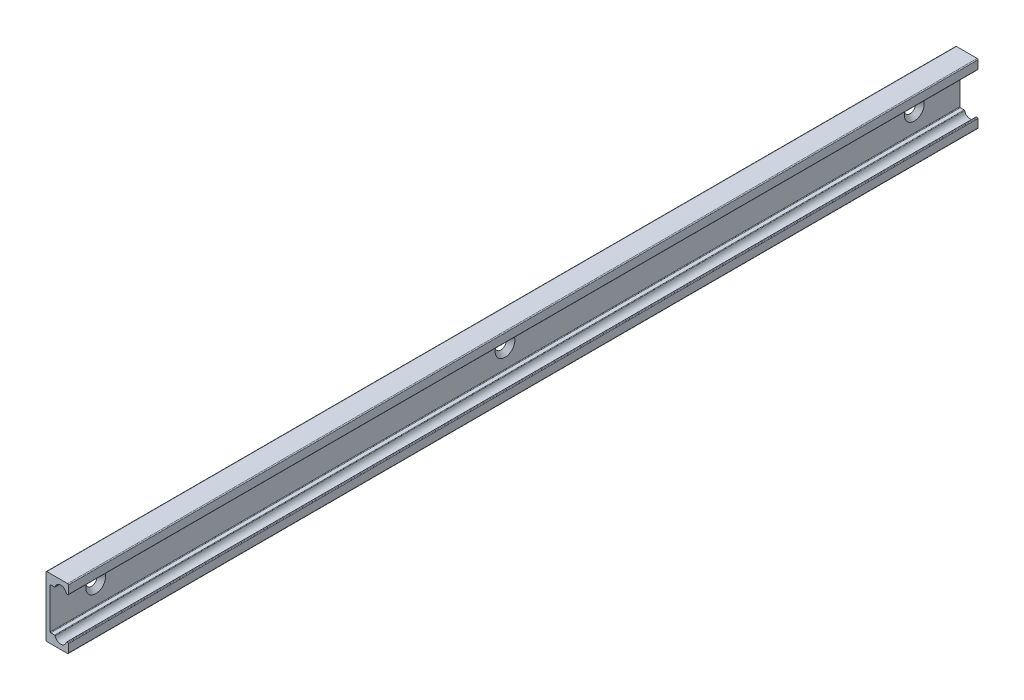
ISO-10303-21;
HEADER;
FILE_DESCRIPTION(('STEP AP214'),'2;1');
FILE_NAME('part.step','',(''),(''),'','','');
FILE_SCHEMA(('AUTOMOTIVE_DESIGN { 1 0 10303 214 1 1 1 1 }'));
ENDSEC;
DATA;
#1=APPLICATION_CONTEXT('core data for automotive mechanical design processes');
#2=APPLICATION_PROTOCOL_DEFINITION('international standard','automotive_design',2000,#1);
#3=PRODUCT_CONTEXT('',#1,'mechanical');
#4=PRODUCT('Part','Part','',(#3));
#5=PRODUCT_RELATED_PRODUCT_CATEGORY('part','',(#4));
#6=PRODUCT_DEFINITION_FORMATION('','',#4);
#7=PRODUCT_DEFINITION_CONTEXT('part definition',#1,'design');
#8=PRODUCT_DEFINITION('design','',#6,#7);
#9=PRODUCT_DEFINITION_SHAPE('','',#8);
#10=(LENGTH_UNIT() NAMED_UNIT(*) SI_UNIT(.MILLI.,.METRE.));
#11=(NAMED_UNIT(*) PLANE_ANGLE_UNIT() SI_UNIT($,.RADIAN.));
#12=(NAMED_UNIT(*) SI_UNIT($,.STERADIAN.) SOLID_ANGLE_UNIT());
#13=UNCERTAINTY_MEASURE_WITH_UNIT(LENGTH_MEASURE(1.E-05),#10,'distance_accuracy_value','');
#14=(GEOMETRIC_REPRESENTATION_CONTEXT(3) GLOBAL_UNCERTAINTY_ASSIGNED_CONTEXT((#13)) GLOBAL_UNIT_ASSIGNED_CONTEXT((#10,
#11,#12)) REPRESENTATION_CONTEXT('',''));
#15=CARTESIAN_POINT('',(0.,0.,0.));
#16=DIRECTION('',(0.,0.,1.));
#17=DIRECTION('',(1.,0.,0.));
#18=AXIS2_PLACEMENT_3D('',#15,#16,#17);
#19=CARTESIAN_POINT('',(-2.2,15.75,500.));
#20=DIRECTION('',(1.,0.,0.));
#21=DIRECTION('',(0.,0.,-1.));
#22=AXIS2_PLACEMENT_3D('',#19,#20,#21);
#23=PLANE('',#22);
#24=CARTESIAN_POINT('',(-2.2,6.05,350.));
#25=DIRECTION('',(1.,0.,0.));
#26=DIRECTION('',(0.,0.,-1.));
#27=AXIS2_PLACEMENT_3D('',#24,#25,#26);
#28=CIRCLE('',#27,1.85);
#29=CARTESIAN_POINT('',(-2.2,6.05,348.15));
#30=VERTEX_POINT('',#29);
#31=EDGE_CURVE('E12',#30,#30,#28,.T.);
#32=ORIENTED_EDGE('',*,*,#31,.T.);
#33=EDGE_LOOP('',(#32));
#34=FACE_BOUND('',#33,.T.);
#35=CARTESIAN_POINT('',(-2.2,6.05,215.));
#36=DIRECTION('',(1.,0.,0.));
#37=DIRECTION('',(0.,0.,-1.));
#38=AXIS2_PLACEMENT_3D('',#35,#36,#37);
#39=CIRCLE('',#38,1.85);
#40=CARTESIAN_POINT('',(-2.2,6.05,213.15));
#41=VERTEX_POINT('',#40);
#42=EDGE_CURVE('E57',#41,#41,#39,.T.);
#43=ORIENTED_EDGE('',*,*,#42,.T.);
#44=EDGE_LOOP('',(#43));
#45=FACE_BOUND('',#44,.T.);
#46=CARTESIAN_POINT('',(-2.2,6.05,485.));
#47=DIRECTION('',(1.,0.,0.));
#48=DIRECTION('',(0.,0.,-1.));
#49=AXIS2_PLACEMENT_3D('',#46,#47,#48);
#50=CIRCLE('',#49,1.85);
#51=CARTESIAN_POINT('',(-2.2,6.05,483.15));
#52=VERTEX_POINT('',#51);
#53=EDGE_CURVE('E502',#52,#52,#50,.T.);
#54=ORIENTED_EDGE('',*,*,#53,.T.);
#55=EDGE_LOOP('',(#54));
#56=FACE_BOUND('',#55,.T.);
#57=DIRECTION('',(0.,-1.,0.));
#58=VECTOR('',#57,1.);
#59=CARTESIAN_POINT('',(-2.2,15.75,200.));
#60=LINE('',#59,#58);
#61=CARTESIAN_POINT('',(-2.2,15.75,200.));
#62=VERTEX_POINT('',#61);
#63=CARTESIAN_POINT('',(-2.2,-3.65,200.));
#64=VERTEX_POINT('',#63);
#65=EDGE_CURVE('E64',#62,#64,#60,.T.);
#66=ORIENTED_EDGE('',*,*,#65,.T.);
#67=CARTESIAN_POINT('',(-2.2,-3.65,500.));
#68=DIRECTION('',(0.,0.,-1.));
#69=VECTOR('',#68,1.);
#70=LINE('',#67,#69);
#71=CARTESIAN_POINT('',(-2.2,-3.65,500.));
#72=VERTEX_POINT('',#71);
#73=EDGE_CURVE('E68',#72,#64,#70,.T.);
#74=ORIENTED_EDGE('',*,*,#73,.F.);
#75=DIRECTION('',(0.,-1.,0.));
#76=VECTOR('',#75,1.);
#77=CARTESIAN_POINT('',(-2.2,15.75,500.));
#78=LINE('',#77,#76);
#79=CARTESIAN_POINT('',(-2.2,15.75,500.));
#80=VERTEX_POINT('',#79);
#81=EDGE_CURVE('E1216',#80,#72,#78,.T.);
#82=ORIENTED_EDGE('',*,*,#81,.F.);
#83=CARTESIAN_POINT('',(-2.2,15.75,500.));
#84=DIRECTION('',(0.,0.,-1.));
#85=VECTOR('',#84,1.);
#86=LINE('',#83,#85);
#87=EDGE_CURVE('E229',#80,#62,#86,.T.);
#88=ORIENTED_EDGE('',*,*,#87,.T.);
#89=EDGE_LOOP('',(#66,#74,#82,#88));
#90=FACE_BOUND('',#89,.T.);
#91=ADVANCED_FACE('F48',(#34,#45,#56,#90),#23,.F.);
#92=CARTESIAN_POINT('',(-1.9,-3.65,500.));
#93=DIRECTION('',(0.,0.,-1.));
#94=DIRECTION('',(-1.,0.,0.));
#95=AXIS2_PLACEMENT_3D('',#92,#93,#94);
#96=CYLINDRICAL_SURFACE('',#95,0.3);
#97=CARTESIAN_POINT('',(-1.9,-3.65,200.));
#98=DIRECTION('',(0.,0.,1.));
#99=DIRECTION('',(1.,0.,0.));
#100=AXIS2_PLACEMENT_3D('',#97,#98,#99);
#101=CIRCLE('',#100,0.3);
#102=CARTESIAN_POINT('',(-1.9,-3.95,200.));
#103=VERTEX_POINT('',#102);
#104=EDGE_CURVE('E1203',#64,#103,#101,.T.);
#105=ORIENTED_EDGE('',*,*,#104,.T.);
#106=CARTESIAN_POINT('',(-1.9,-3.95,500.));
#107=DIRECTION('',(0.,0.,-1.));
#108=VECTOR('',#107,1.);
#109=LINE('',#106,#108);
#110=CARTESIAN_POINT('',(-1.9,-3.95,500.));
#111=VERTEX_POINT('',#110);
#112=EDGE_CURVE('E1120',#111,#103,#109,.T.);
#113=ORIENTED_EDGE('',*,*,#112,.F.);
#114=CARTESIAN_POINT('',(-1.9,-3.65,500.));
#115=DIRECTION('',(0.,0.,1.));
#116=DIRECTION('',(1.,0.,0.));
#117=AXIS2_PLACEMENT_3D('',#114,#115,#116);
#118=CIRCLE('',#117,0.3);
#119=EDGE_CURVE('E1189',#72,#111,#118,.T.);
#120=ORIENTED_EDGE('',*,*,#119,.F.);
#121=ORIENTED_EDGE('',*,*,#73,.T.);
#122=EDGE_LOOP('',(#105,#113,#120,#121));
#123=FACE_BOUND('',#122,.T.);
#124=ADVANCED_FACE('F487',(#123),#96,.T.);
#125=CARTESIAN_POINT('',(-1.9,-3.95,500.));
#126=DIRECTION('',(0.,1.,0.));
#127=DIRECTION('',(0.,0.,1.));
#128=AXIS2_PLACEMENT_3D('',#125,#126,#127);
#129=PLANE('',#128);
#130=DIRECTION('',(1.,0.,0.));
#131=VECTOR('',#130,1.);
#132=CARTESIAN_POINT('',(-1.9,-3.95,200.));
#133=LINE('',#132,#131);
#134=CARTESIAN_POINT('',(4.9,-3.95,200.));
#135=VERTEX_POINT('',#134);
#136=EDGE_CURVE('E1177',#103,#135,#133,.T.);
#137=ORIENTED_EDGE('',*,*,#136,.T.);
#138=CARTESIAN_POINT('',(4.9,-3.95,500.));
#139=DIRECTION('',(0.,0.,-1.));
#140=VECTOR('',#139,1.);
#141=LINE('',#138,#140);
#142=CARTESIAN_POINT('',(4.9,-3.95,500.));
#143=VERTEX_POINT('',#142);
#144=EDGE_CURVE('E1124',#143,#135,#141,.T.);
#145=ORIENTED_EDGE('',*,*,#144,.F.);
#146=DIRECTION('',(1.,0.,0.));
#147=VECTOR('',#146,1.);
#148=CARTESIAN_POINT('',(-1.9,-3.95,500.));
#149=LINE('',#148,#147);
#150=EDGE_CURVE('E1122',#111,#143,#149,.T.);
#151=ORIENTED_EDGE('',*,*,#150,.F.);
#152=ORIENTED_EDGE('',*,*,#112,.T.);
#153=EDGE_LOOP('',(#137,#145,#151,#152));
#154=FACE_BOUND('',#153,.T.);
#155=ADVANCED_FACE('F493',(#154),#129,.F.);
#156=CARTESIAN_POINT('',(4.9,-3.65,500.));
#157=DIRECTION('',(0.,0.,-1.));
#158=DIRECTION('',(-1.,0.,0.));
#159=AXIS2_PLACEMENT_3D('',#156,#157,#158);
#160=CYLINDRICAL_SURFACE('',#159,0.3);
#161=CARTESIAN_POINT('',(4.9,-3.65,200.));
#162=DIRECTION('',(0.,0.,1.));
#163=DIRECTION('',(1.,0.,0.));
#164=AXIS2_PLACEMENT_3D('',#161,#162,#163);
#165=CIRCLE('',#164,0.3);
#166=CARTESIAN_POINT('',(5.2,-3.65,200.));
#167=VERTEX_POINT('',#166);
#168=EDGE_CURVE('E1125',#135,#167,#165,.T.);
#169=ORIENTED_EDGE('',*,*,#168,.T.);
#170=DIRECTION('',(0.,0.,-1.));
#171=VECTOR('',#170,1.);
#172=CARTESIAN_POINT('',(5.2,-3.65,500.));
#173=LINE('',#172,#171);
#174=CARTESIAN_POINT('',(5.2,-3.65,500.));
#175=VERTEX_POINT('',#174);
#176=EDGE_CURVE('E1142',#175,#167,#173,.T.);
#177=ORIENTED_EDGE('',*,*,#176,.F.);
#178=CARTESIAN_POINT('',(4.9,-3.65,500.));
#179=DIRECTION('',(0.,0.,1.));
#180=DIRECTION('',(1.,0.,0.));
#181=AXIS2_PLACEMENT_3D('',#178,#179,#180);
#182=CIRCLE('',#181,0.3);
#183=EDGE_CURVE('E1140',#143,#175,#182,.T.);
#184=ORIENTED_EDGE('',*,*,#183,.F.);
#185=ORIENTED_EDGE('',*,*,#144,.T.);
#186=EDGE_LOOP('',(#169,#177,#184,#185));
#187=FACE_BOUND('',#186,.T.);
#188=ADVANCED_FACE('F901',(#187),#160,.T.);
#189=CARTESIAN_POINT('',(5.2,-3.65,500.));
#190=DIRECTION('',(-1.,0.,0.));
#191=DIRECTION('',(0.,0.,1.));
#192=AXIS2_PLACEMENT_3D('',#189,#190,#191);
#193=PLANE('',#192);
#194=DIRECTION('',(0.,1.,0.));
#195=VECTOR('',#194,1.);
#196=CARTESIAN_POINT('',(5.2,-3.65,200.));
#197=LINE('',#196,#195);
#198=CARTESIAN_POINT('',(5.2,-1.,200.));
#199=VERTEX_POINT('',#198);
#200=EDGE_CURVE('E1150',#167,#199,#197,.T.);
#201=ORIENTED_EDGE('',*,*,#200,.T.);
#202=DIRECTION('',(0.,0.,-1.));
#203=VECTOR('',#202,1.);
#204=CARTESIAN_POINT('',(5.2,-1.,500.));
#205=LINE('',#204,#203);
#206=CARTESIAN_POINT('',(5.2,-1.,500.));
#207=VERTEX_POINT('',#206);
#208=EDGE_CURVE('E1158',#207,#199,#205,.T.);
#209=ORIENTED_EDGE('',*,*,#208,.F.);
#210=DIRECTION('',(0.,1.,0.));
#211=VECTOR('',#210,1.);
#212=CARTESIAN_POINT('',(5.2,-3.65,500.));
#213=LINE('',#212,#211);
#214=EDGE_CURVE('E1153',#175,#207,#213,.T.);
#215=ORIENTED_EDGE('',*,*,#214,.F.);
#216=ORIENTED_EDGE('',*,*,#176,.T.);
#217=EDGE_LOOP('',(#201,#209,#215,#216));
#218=FACE_BOUND('',#217,.T.);
#219=ADVANCED_FACE('F892',(#218),#193,.F.);
#220=CARTESIAN_POINT('',(5.,-1.,500.));
#221=DIRECTION('',(0.,0.,-1.));
#222=DIRECTION('',(-1.,0.,0.));
#223=AXIS2_PLACEMENT_3D('',#220,#221,#222);
#224=CYLINDRICAL_SURFACE('',#223,0.2);
#225=CARTESIAN_POINT('',(5.,-1.,200.));
#226=DIRECTION('',(0.,0.,1.));
#227=DIRECTION('',(1.,0.,0.));
#228=AXIS2_PLACEMENT_3D('',#225,#226,#227);
#229=CIRCLE('',#228,0.2);
#230=CARTESIAN_POINT('',(5.,-0.8,200.));
#231=VERTEX_POINT('',#230);
#232=EDGE_CURVE('E1157',#199,#231,#229,.T.);
#233=ORIENTED_EDGE('',*,*,#232,.T.);
#234=DIRECTION('',(0.,0.,-1.));
#235=VECTOR('',#234,1.);
#236=CARTESIAN_POINT('',(5.,-0.8,500.));
#237=LINE('',#236,#235);
#238=CARTESIAN_POINT('',(5.,-0.8,500.));
#239=VERTEX_POINT('',#238);
#240=EDGE_CURVE('E1232',#239,#231,#237,.T.);
#241=ORIENTED_EDGE('',*,*,#240,.F.);
#242=CARTESIAN_POINT('',(5.,-1.,500.));
#243=DIRECTION('',(0.,0.,1.));
#244=DIRECTION('',(1.,0.,0.));
#245=AXIS2_PLACEMENT_3D('',#242,#243,#244);
#246=CIRCLE('',#245,0.2);
#247=EDGE_CURVE('E1231',#207,#239,#246,.T.);
#248=ORIENTED_EDGE('',*,*,#247,.F.);
#249=ORIENTED_EDGE('',*,*,#208,.T.);
#250=EDGE_LOOP('',(#233,#241,#248,#249));
#251=FACE_BOUND('',#250,.T.);
#252=ADVANCED_FACE('F883',(#251),#224,.T.);
#253=CARTESIAN_POINT('',(-1.9,-0.8,500.));
#254=DIRECTION('',(0.,-1.,0.));
#255=DIRECTION('',(0.,0.,-1.));
#256=AXIS2_PLACEMENT_3D('',#253,#254,#255);
#257=PLANE('',#256);
#258=DIRECTION('',(-1.,0.,0.));
#259=VECTOR('',#258,1.);
#260=CARTESIAN_POINT('',(-1.9,-0.8,200.));
#261=LINE('',#260,#259);
#262=CARTESIAN_POINT('',(4.68587204902469,-0.8,200.));
#263=VERTEX_POINT('',#262);
#264=EDGE_CURVE('E1240',#231,#263,#261,.T.);
#265=ORIENTED_EDGE('',*,*,#264,.T.);
#266=DIRECTION('',(0.,0.,-1.));
#267=VECTOR('',#266,1.);
#268=CARTESIAN_POINT('',(4.68587204902469,-0.8,500.));
#269=LINE('',#268,#267);
#270=CARTESIAN_POINT('',(4.68587204902469,-0.8,500.));
#271=VERTEX_POINT('',#270);
#272=EDGE_CURVE('E1247',#271,#263,#269,.T.);
#273=ORIENTED_EDGE('',*,*,#272,.F.);
#274=DIRECTION('',(-1.,0.,0.));
#275=VECTOR('',#274,1.);
#276=CARTESIAN_POINT('',(-1.9,-0.8,500.));
#277=LINE('',#276,#275);
#278=EDGE_CURVE('E1244',#239,#271,#277,.T.);
#279=ORIENTED_EDGE('',*,*,#278,.F.);
#280=ORIENTED_EDGE('',*,*,#240,.T.);
#281=EDGE_LOOP('',(#265,#273,#279,#280));
#282=FACE_BOUND('',#281,.T.);
#283=ADVANCED_FACE('F875',(#282),#257,.F.);
#284=CARTESIAN_POINT('',(4.68587204902469,-1.,500.));
#285=DIRECTION('',(0.,0.,-1.));
#286=DIRECTION('',(-1.,0.,0.));
#287=AXIS2_PLACEMENT_3D('',#284,#285,#286);
#288=CYLINDRICAL_SURFACE('',#287,0.2);
#289=CARTESIAN_POINT('',(4.68587204902469,-1.,200.));
#290=DIRECTION('',(0.,0.,1.));
#291=DIRECTION('',(1.,0.,0.));
#292=AXIS2_PLACEMENT_3D('',#289,#290,#291);
#293=CIRCLE('',#292,0.2);
#294=CARTESIAN_POINT('',(4.4919794729271,-0.950952380952381,200.));
#295=VERTEX_POINT('',#294);
#296=EDGE_CURVE('E1248',#263,#295,#293,.T.);
#297=ORIENTED_EDGE('',*,*,#296,.T.);
#298=CARTESIAN_POINT('',(4.4919794729271,-0.950952380952377,500.));
#299=DIRECTION('',(0.,0.,-1.));
#300=VECTOR('',#299,1.);
#301=LINE('',#298,#300);
#302=CARTESIAN_POINT('',(4.4919794729271,-0.950952380952381,500.));
#303=VERTEX_POINT('',#302);
#304=EDGE_CURVE('E639',#303,#295,#301,.T.);
#305=ORIENTED_EDGE('',*,*,#304,.F.);
#306=CARTESIAN_POINT('',(4.68587204902469,-1.,500.));
#307=DIRECTION('',(0.,0.,1.));
#308=DIRECTION('',(1.,0.,0.));
#309=AXIS2_PLACEMENT_3D('',#306,#307,#308);
#310=CIRCLE('',#309,0.2);
#311=EDGE_CURVE('E1256',#271,#303,#310,.T.);
#312=ORIENTED_EDGE('',*,*,#311,.F.);
#313=ORIENTED_EDGE('',*,*,#272,.T.);
#314=EDGE_LOOP('',(#297,#305,#312,#313));
#315=FACE_BOUND('',#314,.T.);
#316=ADVANCED_FACE('F868',(#315),#288,.T.);
#317=CARTESIAN_POINT('',(2.65,-0.485,500.));
#318=DIRECTION('',(0.,0.,-1.));
#319=DIRECTION('',(-1.,0.,0.));
#320=AXIS2_PLACEMENT_3D('',#317,#318,#319);
#321=CYLINDRICAL_SURFACE('',#320,1.9);
#322=CARTESIAN_POINT('',(2.65,-0.485,200.));
#323=DIRECTION('',(0.,0.,1.));
#324=DIRECTION('',(1.,0.,0.));
#325=AXIS2_PLACEMENT_3D('',#322,#323,#324);
#326=CIRCLE('',#325,1.9);
#327=CARTESIAN_POINT('',(0.808020527072899,-0.950952380952381,200.));
#328=VERTEX_POINT('',#327);
#329=EDGE_CURVE('E1255',#328,#295,#326,.T.);
#330=ORIENTED_EDGE('',*,*,#329,.F.);
#331=CARTESIAN_POINT('',(0.8080205270729,-0.950952380952381,500.));
#332=DIRECTION('',(0.,0.,-1.));
#333=VECTOR('',#332,1.);
#334=LINE('',#331,#333);
#335=CARTESIAN_POINT('',(0.808020527072899,-0.950952380952381,500.));
#336=VERTEX_POINT('',#335);
#337=EDGE_CURVE('E642',#336,#328,#334,.T.);
#338=ORIENTED_EDGE('',*,*,#337,.F.);
#339=CARTESIAN_POINT('',(2.65,-0.485,500.));
#340=DIRECTION('',(0.,0.,1.));
#341=DIRECTION('',(1.,0.,0.));
#342=AXIS2_PLACEMENT_3D('',#339,#340,#341);
#343=CIRCLE('',#342,1.9);
#344=EDGE_CURVE('E623',#336,#303,#343,.T.);
#345=ORIENTED_EDGE('',*,*,#344,.T.);
#346=ORIENTED_EDGE('',*,*,#304,.T.);
#347=EDGE_LOOP('',(#330,#338,#345,#346));
#348=FACE_BOUND('',#347,.T.);
#349=ADVANCED_FACE('F601',(#348),#321,.F.);
#350=CARTESIAN_POINT('',(0.61412795097531,-1.,500.));
#351=DIRECTION('',(0.,0.,-1.));
#352=DIRECTION('',(-1.,0.,0.));
#353=AXIS2_PLACEMENT_3D('',#350,#351,#352);
#354=CYLINDRICAL_SURFACE('',#353,0.2);
#355=CARTESIAN_POINT('',(0.61412795097531,-1.,200.));
#356=DIRECTION('',(0.,0.,1.));
#357=DIRECTION('',(1.,0.,0.));
#358=AXIS2_PLACEMENT_3D('',#355,#356,#357);
#359=CIRCLE('',#358,0.2);
#360=CARTESIAN_POINT('',(0.61412795097531,-0.8,200.));
#361=VERTEX_POINT('',#360);
#362=EDGE_CURVE('E622',#328,#361,#359,.T.);
#363=ORIENTED_EDGE('',*,*,#362,.T.);
#364=CARTESIAN_POINT('',(0.61412795097531,-0.8,500.));
#365=DIRECTION('',(0.,0.,-1.));
#366=VECTOR('',#365,1.);
#367=LINE('',#364,#366);
#368=CARTESIAN_POINT('',(0.61412795097531,-0.8,500.));
#369=VERTEX_POINT('',#368);
#370=EDGE_CURVE('E620',#369,#361,#367,.T.);
#371=ORIENTED_EDGE('',*,*,#370,.F.);
#372=CARTESIAN_POINT('',(0.61412795097531,-1.,500.));
#373=DIRECTION('',(0.,0.,1.));
#374=DIRECTION('',(1.,0.,0.));
#375=AXIS2_PLACEMENT_3D('',#372,#373,#374);
#376=CIRCLE('',#375,0.2);
#377=EDGE_CURVE('E677',#336,#369,#376,.T.);
#378=ORIENTED_EDGE('',*,*,#377,.F.);
#379=ORIENTED_EDGE('',*,*,#337,.T.);
#380=EDGE_LOOP('',(#363,#371,#378,#379));
#381=FACE_BOUND('',#380,.T.);
#382=ADVANCED_FACE('F592',(#381),#354,.T.);
#383=CARTESIAN_POINT('',(0.61412795097531,-0.8,500.));
#384=DIRECTION('',(0.,-1.,0.));
#385=DIRECTION('',(0.,0.,-1.));
#386=AXIS2_PLACEMENT_3D('',#383,#384,#385);
#387=PLANE('',#386);
#388=DIRECTION('',(-1.,0.,0.));
#389=VECTOR('',#388,1.);
#390=CARTESIAN_POINT('',(0.61412795097531,-0.8,200.));
#391=LINE('',#390,#389);
#392=CARTESIAN_POINT('',(-0.6,-0.8,200.));
#393=VERTEX_POINT('',#392);
#394=EDGE_CURVE('E584',#361,#393,#391,.T.);
#395=ORIENTED_EDGE('',*,*,#394,.T.);
#396=CARTESIAN_POINT('',(-0.6,-0.8,500.));
#397=DIRECTION('',(0.,0.,-1.));
#398=VECTOR('',#397,1.);
#399=LINE('',#396,#398);
#400=CARTESIAN_POINT('',(-0.6,-0.8,500.));
#401=VERTEX_POINT('',#400);
#402=EDGE_CURVE('E670',#401,#393,#399,.T.);
#403=ORIENTED_EDGE('',*,*,#402,.F.);
#404=DIRECTION('',(-1.,0.,0.));
#405=VECTOR('',#404,1.);
#406=CARTESIAN_POINT('',(0.61412795097531,-0.8,500.));
#407=LINE('',#406,#405);
#408=EDGE_CURVE('E565',#369,#401,#407,.T.);
#409=ORIENTED_EDGE('',*,*,#408,.F.);
#410=ORIENTED_EDGE('',*,*,#370,.T.);
#411=EDGE_LOOP('',(#395,#403,#409,#410));
#412=FACE_BOUND('',#411,.T.);
#413=ADVANCED_FACE('F539',(#412),#387,.F.);
#414=CARTESIAN_POINT('',(-0.6,-0.6,500.));
#415=DIRECTION('',(0.,0.,-1.));
#416=DIRECTION('',(-1.,0.,0.));
#417=AXIS2_PLACEMENT_3D('',#414,#415,#416);
#418=CYLINDRICAL_SURFACE('',#417,0.2);
#419=CARTESIAN_POINT('',(-0.6,-0.6,200.));
#420=DIRECTION('',(0.,0.,1.));
#421=DIRECTION('',(1.,0.,0.));
#422=AXIS2_PLACEMENT_3D('',#419,#420,#421);
#423=CIRCLE('',#422,0.2);
#424=CARTESIAN_POINT('',(-0.8,-0.6,200.));
#425=VERTEX_POINT('',#424);
#426=EDGE_CURVE('E562',#425,#393,#423,.T.);
#427=ORIENTED_EDGE('',*,*,#426,.F.);
#428=CARTESIAN_POINT('',(-0.8,-0.6,500.));
#429=DIRECTION('',(0.,0.,-1.));
#430=VECTOR('',#429,1.);
#431=LINE('',#428,#430);
#432=CARTESIAN_POINT('',(-0.8,-0.6,500.));
#433=VERTEX_POINT('',#432);
#434=EDGE_CURVE('E560',#433,#425,#431,.T.);
#435=ORIENTED_EDGE('',*,*,#434,.F.);
#436=CARTESIAN_POINT('',(-0.6,-0.6,500.));
#437=DIRECTION('',(0.,0.,1.));
#438=DIRECTION('',(1.,0.,0.));
#439=AXIS2_PLACEMENT_3D('',#436,#437,#438);
#440=CIRCLE('',#439,0.2);
#441=EDGE_CURVE('E519',#433,#401,#440,.T.);
#442=ORIENTED_EDGE('',*,*,#441,.T.);
#443=ORIENTED_EDGE('',*,*,#402,.T.);
#444=EDGE_LOOP('',(#427,#435,#442,#443));
#445=FACE_BOUND('',#444,.T.);
#446=ADVANCED_FACE('F528',(#445),#418,.F.);
#447=CARTESIAN_POINT('',(-0.8,-0.6,500.));
#448=DIRECTION('',(-1.,0.,0.));
#449=DIRECTION('',(0.,0.,1.));
#450=AXIS2_PLACEMENT_3D('',#447,#448,#449);
#451=PLANE('',#450);
#452=CARTESIAN_POINT('',(-0.8,6.05,350.));
#453=DIRECTION('',(-1.,0.,0.));
#454=DIRECTION('',(0.,0.,1.));
#455=AXIS2_PLACEMENT_3D('',#452,#453,#454);
#456=CIRCLE('',#455,3.25);
#457=CARTESIAN_POINT('',(-0.8,6.05,353.25));
#458=VERTEX_POINT('',#457);
#459=EDGE_CURVE('E515',#458,#458,#456,.T.);
#460=ORIENTED_EDGE('',*,*,#459,.T.);
#461=EDGE_LOOP('',(#460));
#462=FACE_BOUND('',#461,.T.);
#463=CARTESIAN_POINT('',(-0.8,6.05,215.));
#464=DIRECTION('',(-1.,0.,0.));
#465=DIRECTION('',(0.,0.,1.));
#466=AXIS2_PLACEMENT_3D('',#463,#464,#465);
#467=CIRCLE('',#466,3.25);
#468=CARTESIAN_POINT('',(-0.8,6.05,218.25));
#469=VERTEX_POINT('',#468);
#470=EDGE_CURVE('E520',#469,#469,#467,.T.);
#471=ORIENTED_EDGE('',*,*,#470,.T.);
#472=EDGE_LOOP('',(#471));
#473=FACE_BOUND('',#472,.T.);
#474=CARTESIAN_POINT('',(-0.8,6.05,485.));
#475=DIRECTION('',(-1.,0.,0.));
#476=DIRECTION('',(0.,0.,1.));
#477=AXIS2_PLACEMENT_3D('',#474,#475,#476);
#478=CIRCLE('',#477,3.25);
#479=CARTESIAN_POINT('',(-0.8,6.05,488.25));
#480=VERTEX_POINT('',#479);
#481=EDGE_CURVE('E1083',#480,#480,#478,.T.);
#482=ORIENTED_EDGE('',*,*,#481,.T.);
#483=EDGE_LOOP('',(#482));
#484=FACE_BOUND('',#483,.T.);
#485=DIRECTION('',(0.,1.,0.));
#486=VECTOR('',#485,1.);
#487=CARTESIAN_POINT('',(-0.8,-0.6,200.));
#488=LINE('',#487,#486);
#489=CARTESIAN_POINT('',(-0.8,12.7,200.));
#490=VERTEX_POINT('',#489);
#491=EDGE_CURVE('E682',#425,#490,#488,.T.);
#492=ORIENTED_EDGE('',*,*,#491,.T.);
#493=CARTESIAN_POINT('',(-0.8,12.7,500.));
#494=DIRECTION('',(0.,0.,-1.));
#495=VECTOR('',#494,1.);
#496=LINE('',#493,#495);
#497=CARTESIAN_POINT('',(-0.8,12.7,500.));
#498=VERTEX_POINT('',#497);
#499=EDGE_CURVE('E693',#498,#490,#496,.T.);
#500=ORIENTED_EDGE('',*,*,#499,.F.);
#501=DIRECTION('',(0.,1.,0.));
#502=VECTOR('',#501,1.);
#503=CARTESIAN_POINT('',(-0.8,-0.6,500.));
#504=LINE('',#503,#502);
#505=EDGE_CURVE('E686',#433,#498,#504,.T.);
#506=ORIENTED_EDGE('',*,*,#505,.F.);
#507=ORIENTED_EDGE('',*,*,#434,.T.);
#508=EDGE_LOOP('',(#492,#500,#506,#507));
#509=FACE_BOUND('',#508,.T.);
#510=ADVANCED_FACE('F538',(#462,#473,#484,#509),#451,.F.);
#511=CARTESIAN_POINT('',(-0.6,12.7,500.));
#512=DIRECTION('',(0.,0.,-1.));
#513=DIRECTION('',(-1.,0.,0.));
#514=AXIS2_PLACEMENT_3D('',#511,#512,#513);
#515=CYLINDRICAL_SURFACE('',#514,0.2);
#516=CARTESIAN_POINT('',(-0.6,12.7,200.));
#517=DIRECTION('',(0.,0.,1.));
#518=DIRECTION('',(1.,0.,0.));
#519=AXIS2_PLACEMENT_3D('',#516,#517,#518);
#520=CIRCLE('',#519,0.2);
#521=CARTESIAN_POINT('',(-0.6,12.9,200.));
#522=VERTEX_POINT('',#521);
#523=EDGE_CURVE('E694',#522,#490,#520,.T.);
#524=ORIENTED_EDGE('',*,*,#523,.F.);
#525=DIRECTION('',(0.,0.,-1.));
#526=VECTOR('',#525,1.);
#527=CARTESIAN_POINT('',(-0.6,12.9,500.));
#528=LINE('',#527,#526);
#529=CARTESIAN_POINT('',(-0.6,12.9,500.));
#530=VERTEX_POINT('',#529);
#531=EDGE_CURVE('E710',#530,#522,#528,.T.);
#532=ORIENTED_EDGE('',*,*,#531,.F.);
#533=CARTESIAN_POINT('',(-0.6,12.7,500.));
#534=DIRECTION('',(0.,0.,1.));
#535=DIRECTION('',(1.,0.,0.));
#536=AXIS2_PLACEMENT_3D('',#533,#534,#535);
#537=CIRCLE('',#536,0.2);
#538=EDGE_CURVE('E708',#530,#498,#537,.T.);
#539=ORIENTED_EDGE('',*,*,#538,.T.);
#540=ORIENTED_EDGE('',*,*,#499,.T.);
#541=EDGE_LOOP('',(#524,#532,#539,#540));
#542=FACE_BOUND('',#541,.T.);
#543=ADVANCED_FACE('F728',(#542),#515,.F.);
#544=CARTESIAN_POINT('',(-1.9,12.9,500.));
#545=DIRECTION('',(0.,1.,0.));
#546=DIRECTION('',(0.,0.,1.));
#547=AXIS2_PLACEMENT_3D('',#544,#545,#546);
#548=PLANE('',#547);
#549=DIRECTION('',(1.,0.,0.));
#550=VECTOR('',#549,1.);
#551=CARTESIAN_POINT('',(-1.9,12.9,200.));
#552=LINE('',#551,#550);
#553=CARTESIAN_POINT('',(0.61412795097531,12.9,200.));
#554=VERTEX_POINT('',#553);
#555=EDGE_CURVE('E721',#522,#554,#552,.T.);
#556=ORIENTED_EDGE('',*,*,#555,.T.);
#557=DIRECTION('',(0.,0.,-1.));
#558=VECTOR('',#557,1.);
#559=CARTESIAN_POINT('',(0.61412795097531,12.9,500.));
#560=LINE('',#559,#558);
#561=CARTESIAN_POINT('',(0.61412795097531,12.9,500.));
#562=VERTEX_POINT('',#561);
#563=EDGE_CURVE('E725',#562,#554,#560,.T.);
#564=ORIENTED_EDGE('',*,*,#563,.F.);
#565=DIRECTION('',(1.,0.,0.));
#566=VECTOR('',#565,1.);
#567=CARTESIAN_POINT('',(-1.9,12.9,500.));
#568=LINE('',#567,#566);
#569=EDGE_CURVE('E766',#530,#562,#568,.T.);
#570=ORIENTED_EDGE('',*,*,#569,.F.);
#571=ORIENTED_EDGE('',*,*,#531,.T.);
#572=EDGE_LOOP('',(#556,#564,#570,#571));
#573=FACE_BOUND('',#572,.T.);
#574=ADVANCED_FACE('F737',(#573),#548,.F.);
#575=CARTESIAN_POINT('',(0.61412795097531,13.1,500.));
#576=DIRECTION('',(0.,0.,-1.));
#577=DIRECTION('',(-1.,0.,0.));
#578=AXIS2_PLACEMENT_3D('',#575,#576,#577);
#579=CYLINDRICAL_SURFACE('',#578,0.2);
#580=CARTESIAN_POINT('',(0.61412795097531,13.1,200.));
#581=DIRECTION('',(0.,0.,1.));
#582=DIRECTION('',(1.,0.,0.));
#583=AXIS2_PLACEMENT_3D('',#580,#581,#582);
#584=CIRCLE('',#583,0.2);
#585=CARTESIAN_POINT('',(0.808020527072899,13.0509523809524,200.));
#586=VERTEX_POINT('',#585);
#587=EDGE_CURVE('E765',#554,#586,#584,.T.);
#588=ORIENTED_EDGE('',*,*,#587,.T.);
#589=CARTESIAN_POINT('',(0.808020527072897,13.0509523809524,500.));
#590=DIRECTION('',(0.,0.,-1.));
#591=VECTOR('',#590,1.);
#592=LINE('',#589,#591);
#593=CARTESIAN_POINT('',(0.808020527072899,13.0509523809524,500.));
#594=VERTEX_POINT('',#593);
#595=EDGE_CURVE('E763',#594,#586,#592,.T.);
#596=ORIENTED_EDGE('',*,*,#595,.F.);
#597=CARTESIAN_POINT('',(0.61412795097531,13.1,500.));
#598=DIRECTION('',(0.,0.,1.));
#599=DIRECTION('',(1.,0.,0.));
#600=AXIS2_PLACEMENT_3D('',#597,#598,#599);
#601=CIRCLE('',#600,0.2);
#602=EDGE_CURVE('E776',#562,#594,#601,.T.);
#603=ORIENTED_EDGE('',*,*,#602,.F.);
#604=ORIENTED_EDGE('',*,*,#563,.T.);
#605=EDGE_LOOP('',(#588,#596,#603,#604));
#606=FACE_BOUND('',#605,.T.);
#607=ADVANCED_FACE('F741',(#606),#579,.T.);
#608=CARTESIAN_POINT('',(2.65,12.585,500.));
#609=DIRECTION('',(0.,0.,-1.));
#610=DIRECTION('',(-1.,0.,0.));
#611=AXIS2_PLACEMENT_3D('',#608,#609,#610);
#612=CYLINDRICAL_SURFACE('',#611,1.9);
#613=CARTESIAN_POINT('',(2.65,12.585,200.));
#614=DIRECTION('',(0.,0.,1.));
#615=DIRECTION('',(1.,0.,0.));
#616=AXIS2_PLACEMENT_3D('',#613,#614,#615);
#617=CIRCLE('',#616,1.9);
#618=CARTESIAN_POINT('',(4.4919794729271,13.0509523809524,200.));
#619=VERTEX_POINT('',#618);
#620=EDGE_CURVE('E779',#619,#586,#617,.T.);
#621=ORIENTED_EDGE('',*,*,#620,.F.);
#622=CARTESIAN_POINT('',(4.49197947292711,13.0509523809524,500.));
#623=DIRECTION('',(0.,0.,-1.));
#624=VECTOR('',#623,1.);
#625=LINE('',#622,#624);
#626=CARTESIAN_POINT('',(4.4919794729271,13.0509523809524,500.));
#627=VERTEX_POINT('',#626);
#628=EDGE_CURVE('E442',#627,#619,#625,.T.);
#629=ORIENTED_EDGE('',*,*,#628,.F.);
#630=CARTESIAN_POINT('',(2.65,12.585,500.));
#631=DIRECTION('',(0.,0.,1.));
#632=DIRECTION('',(1.,0.,0.));
#633=AXIS2_PLACEMENT_3D('',#630,#631,#632);
#634=CIRCLE('',#633,1.9);
#635=EDGE_CURVE('E783',#627,#594,#634,.T.);
#636=ORIENTED_EDGE('',*,*,#635,.T.);
#637=ORIENTED_EDGE('',*,*,#595,.T.);
#638=EDGE_LOOP('',(#621,#629,#636,#637));
#639=FACE_BOUND('',#638,.T.);
#640=ADVANCED_FACE('F745',(#639),#612,.F.);
#641=CARTESIAN_POINT('',(4.6858720490247,13.1,500.));
#642=DIRECTION('',(0.,0.,-1.));
#643=DIRECTION('',(-1.,0.,0.));
#644=AXIS2_PLACEMENT_3D('',#641,#642,#643);
#645=CYLINDRICAL_SURFACE('',#644,0.2);
#646=CARTESIAN_POINT('',(4.6858720490247,13.1,200.));
#647=DIRECTION('',(0.,0.,1.));
#648=DIRECTION('',(1.,0.,0.));
#649=AXIS2_PLACEMENT_3D('',#646,#647,#648);
#650=CIRCLE('',#649,0.2);
#651=CARTESIAN_POINT('',(4.6858720490247,12.9,200.));
#652=VERTEX_POINT('',#651);
#653=EDGE_CURVE('E780',#619,#652,#650,.T.);
#654=ORIENTED_EDGE('',*,*,#653,.T.);
#655=CARTESIAN_POINT('',(4.68587204902469,12.9,500.));
#656=DIRECTION('',(0.,0.,-1.));
#657=VECTOR('',#656,1.);
#658=LINE('',#655,#657);
#659=CARTESIAN_POINT('',(4.6858720490247,12.9,500.));
#660=VERTEX_POINT('',#659);
#661=EDGE_CURVE('E446',#660,#652,#658,.T.);
#662=ORIENTED_EDGE('',*,*,#661,.F.);
#663=CARTESIAN_POINT('',(4.6858720490247,13.1,500.));
#664=DIRECTION('',(0.,0.,1.));
#665=DIRECTION('',(1.,0.,0.));
#666=AXIS2_PLACEMENT_3D('',#663,#664,#665);
#667=CIRCLE('',#666,0.2);
#668=EDGE_CURVE('E426',#627,#660,#667,.T.);
#669=ORIENTED_EDGE('',*,*,#668,.F.);
#670=ORIENTED_EDGE('',*,*,#628,.T.);
#671=EDGE_LOOP('',(#654,#662,#669,#670));
#672=FACE_BOUND('',#671,.T.);
#673=ADVANCED_FACE('F404',(#672),#645,.T.);
#674=CARTESIAN_POINT('',(4.68587204902469,12.9,500.));
#675=DIRECTION('',(0.,1.,0.));
#676=DIRECTION('',(0.,0.,1.));
#677=AXIS2_PLACEMENT_3D('',#674,#675,#676);
#678=PLANE('',#677);
#679=DIRECTION('',(1.,0.,0.));
#680=VECTOR('',#679,1.);
#681=CARTESIAN_POINT('',(4.68587204902469,12.9,200.));
#682=LINE('',#681,#680);
#683=CARTESIAN_POINT('',(5.,12.9,200.));
#684=VERTEX_POINT('',#683);
#685=EDGE_CURVE('E425',#652,#684,#682,.T.);
#686=ORIENTED_EDGE('',*,*,#685,.T.);
#687=CARTESIAN_POINT('',(5.,12.9,500.));
#688=DIRECTION('',(0.,0.,-1.));
#689=VECTOR('',#688,1.);
#690=LINE('',#687,#689);
#691=CARTESIAN_POINT('',(5.,12.9,500.));
#692=VERTEX_POINT('',#691);
#693=EDGE_CURVE('E423',#692,#684,#690,.T.);
#694=ORIENTED_EDGE('',*,*,#693,.F.);
#695=DIRECTION('',(1.,0.,0.));
#696=VECTOR('',#695,1.);
#697=CARTESIAN_POINT('',(4.68587204902469,12.9,500.));
#698=LINE('',#697,#696);
#699=EDGE_CURVE('E477',#660,#692,#698,.T.);
#700=ORIENTED_EDGE('',*,*,#699,.F.);
#701=ORIENTED_EDGE('',*,*,#661,.T.);
#702=EDGE_LOOP('',(#686,#694,#700,#701));
#703=FACE_BOUND('',#702,.T.);
#704=ADVANCED_FACE('F395',(#703),#678,.F.);
#705=CARTESIAN_POINT('',(5.,13.1,500.));
#706=DIRECTION('',(0.,0.,-1.));
#707=DIRECTION('',(-1.,0.,0.));
#708=AXIS2_PLACEMENT_3D('',#705,#706,#707);
#709=CYLINDRICAL_SURFACE('',#708,0.2);
#710=CARTESIAN_POINT('',(5.,13.1,200.));
#711=DIRECTION('',(0.,0.,1.));
#712=DIRECTION('',(1.,0.,0.));
#713=AXIS2_PLACEMENT_3D('',#710,#711,#712);
#714=CIRCLE('',#713,0.2);
#715=CARTESIAN_POINT('',(5.2,13.1,200.));
#716=VERTEX_POINT('',#715);
#717=EDGE_CURVE('E387',#684,#716,#714,.T.);
#718=ORIENTED_EDGE('',*,*,#717,.T.);
#719=CARTESIAN_POINT('',(5.2,13.1,500.));
#720=DIRECTION('',(0.,0.,-1.));
#721=VECTOR('',#720,1.);
#722=LINE('',#719,#721);
#723=CARTESIAN_POINT('',(5.2,13.1,500.));
#724=VERTEX_POINT('',#723);
#725=EDGE_CURVE('E472',#724,#716,#722,.T.);
#726=ORIENTED_EDGE('',*,*,#725,.F.);
#727=CARTESIAN_POINT('',(5.,13.1,500.));
#728=DIRECTION('',(0.,0.,1.));
#729=DIRECTION('',(1.,0.,0.));
#730=AXIS2_PLACEMENT_3D('',#727,#728,#729);
#731=CIRCLE('',#730,0.2);
#732=EDGE_CURVE('E372',#692,#724,#731,.T.);
#733=ORIENTED_EDGE('',*,*,#732,.F.);
#734=ORIENTED_EDGE('',*,*,#693,.T.);
#735=EDGE_LOOP('',(#718,#726,#733,#734));
#736=FACE_BOUND('',#735,.T.);
#737=ADVANCED_FACE('F352',(#736),#709,.T.);
#738=CARTESIAN_POINT('',(5.2,13.1,500.));
#739=DIRECTION('',(-1.,0.,0.));
#740=DIRECTION('',(0.,0.,1.));
#741=AXIS2_PLACEMENT_3D('',#738,#739,#740);
#742=PLANE('',#741);
#743=DIRECTION('',(0.,1.,0.));
#744=VECTOR('',#743,1.);
#745=CARTESIAN_POINT('',(5.2,13.1,200.));
#746=LINE('',#745,#744);
#747=CARTESIAN_POINT('',(5.2,15.75,200.));
#748=VERTEX_POINT('',#747);
#749=EDGE_CURVE('E370',#716,#748,#746,.T.);
#750=ORIENTED_EDGE('',*,*,#749,.T.);
#751=CARTESIAN_POINT('',(5.2,15.75,500.));
#752=DIRECTION('',(0.,0.,-1.));
#753=VECTOR('',#752,1.);
#754=LINE('',#751,#753);
#755=CARTESIAN_POINT('',(5.2,15.75,500.));
#756=VERTEX_POINT('',#755);
#757=EDGE_CURVE('E318',#756,#748,#754,.T.);
#758=ORIENTED_EDGE('',*,*,#757,.F.);
#759=DIRECTION('',(0.,1.,0.));
#760=VECTOR('',#759,1.);
#761=CARTESIAN_POINT('',(5.2,13.1,500.));
#762=LINE('',#761,#760);
#763=EDGE_CURVE('E334',#724,#756,#762,.T.);
#764=ORIENTED_EDGE('',*,*,#763,.F.);
#765=ORIENTED_EDGE('',*,*,#725,.T.);
#766=EDGE_LOOP('',(#750,#758,#764,#765));
#767=FACE_BOUND('',#766,.T.);
#768=ADVANCED_FACE('F343',(#767),#742,.F.);
#769=CARTESIAN_POINT('',(4.9,15.75,500.));
#770=DIRECTION('',(0.,0.,-1.));
#771=DIRECTION('',(-1.,0.,0.));
#772=AXIS2_PLACEMENT_3D('',#769,#770,#771);
#773=CYLINDRICAL_SURFACE('',#772,0.3);
#774=CARTESIAN_POINT('',(4.9,15.75,200.));
#775=DIRECTION('',(0.,0.,1.));
#776=DIRECTION('',(1.,0.,0.));
#777=AXIS2_PLACEMENT_3D('',#774,#775,#776);
#778=CIRCLE('',#777,0.3);
#779=CARTESIAN_POINT('',(4.9,16.05,200.));
#780=VERTEX_POINT('',#779);
#781=EDGE_CURVE('E333',#748,#780,#778,.T.);
#782=ORIENTED_EDGE('',*,*,#781,.T.);
#783=CARTESIAN_POINT('',(4.90000000000001,16.05,500.));
#784=DIRECTION('',(0.,0.,-1.));
#785=VECTOR('',#784,1.);
#786=LINE('',#783,#785);
#787=CARTESIAN_POINT('',(4.9,16.05,500.));
#788=VERTEX_POINT('',#787);
#789=EDGE_CURVE('E320',#788,#780,#786,.T.);
#790=ORIENTED_EDGE('',*,*,#789,.F.);
#791=CARTESIAN_POINT('',(4.9,15.75,500.));
#792=DIRECTION('',(0.,0.,1.));
#793=DIRECTION('',(1.,0.,0.));
#794=AXIS2_PLACEMENT_3D('',#791,#792,#793);
#795=CIRCLE('',#794,0.3);
#796=EDGE_CURVE('E238',#756,#788,#795,.T.);
#797=ORIENTED_EDGE('',*,*,#796,.F.);
#798=ORIENTED_EDGE('',*,*,#757,.T.);
#799=EDGE_LOOP('',(#782,#790,#797,#798));
#800=FACE_BOUND('',#799,.T.);
#801=ADVANCED_FACE('F285',(#800),#773,.T.);
#802=CARTESIAN_POINT('',(4.9,16.05,500.));
#803=DIRECTION('',(0.,-1.,0.));
#804=DIRECTION('',(0.,0.,-1.));
#805=AXIS2_PLACEMENT_3D('',#802,#803,#804);
#806=PLANE('',#805);
#807=DIRECTION('',(-1.,0.,0.));
#808=VECTOR('',#807,1.);
#809=CARTESIAN_POINT('',(4.9,16.05,200.));
#810=LINE('',#809,#808);
#811=CARTESIAN_POINT('',(-1.9,16.05,200.));
#812=VERTEX_POINT('',#811);
#813=EDGE_CURVE('E218',#780,#812,#810,.T.);
#814=ORIENTED_EDGE('',*,*,#813,.T.);
#815=CARTESIAN_POINT('',(-1.9,16.05,500.));
#816=DIRECTION('',(0.,0.,-1.));
#817=VECTOR('',#816,1.);
#818=LINE('',#815,#817);
#819=CARTESIAN_POINT('',(-1.9,16.05,500.));
#820=VERTEX_POINT('',#819);
#821=EDGE_CURVE('E209',#820,#812,#818,.T.);
#822=ORIENTED_EDGE('',*,*,#821,.F.);
#823=DIRECTION('',(-1.,0.,0.));
#824=VECTOR('',#823,1.);
#825=CARTESIAN_POINT('',(4.9,16.05,500.));
#826=LINE('',#825,#824);
#827=EDGE_CURVE('E215',#788,#820,#826,.T.);
#828=ORIENTED_EDGE('',*,*,#827,.F.);
#829=ORIENTED_EDGE('',*,*,#789,.T.);
#830=EDGE_LOOP('',(#814,#822,#828,#829));
#831=FACE_BOUND('',#830,.T.);
#832=ADVANCED_FACE('F212',(#831),#806,.F.);
#833=CARTESIAN_POINT('',(-1.9,15.75,500.));
#834=DIRECTION('',(0.,0.,-1.));
#835=DIRECTION('',(-1.,0.,0.));
#836=AXIS2_PLACEMENT_3D('',#833,#834,#835);
#837=CYLINDRICAL_SURFACE('',#836,0.3);
#838=CARTESIAN_POINT('',(-1.9,15.75,200.));
#839=DIRECTION('',(0.,0.,1.));
#840=DIRECTION('',(1.,0.,0.));
#841=AXIS2_PLACEMENT_3D('',#838,#839,#840);
#842=CIRCLE('',#841,0.3);
#843=EDGE_CURVE('E233',#812,#62,#842,.T.);
#844=ORIENTED_EDGE('',*,*,#843,.T.);
#845=ORIENTED_EDGE('',*,*,#87,.F.);
#846=CARTESIAN_POINT('',(-1.9,15.75,500.));
#847=DIRECTION('',(0.,0.,1.));
#848=DIRECTION('',(1.,0.,0.));
#849=AXIS2_PLACEMENT_3D('',#846,#847,#848);
#850=CIRCLE('',#849,0.3);
#851=EDGE_CURVE('E227',#820,#80,#850,.T.);
#852=ORIENTED_EDGE('',*,*,#851,.F.);
#853=ORIENTED_EDGE('',*,*,#821,.T.);
#854=EDGE_LOOP('',(#844,#845,#852,#853));
#855=FACE_BOUND('',#854,.T.);
#856=ADVANCED_FACE('F228',(#855),#837,.T.);
#857=CARTESIAN_POINT('',(-1.9,-3.65,500.));
#858=DIRECTION('',(0.,0.,1.));
#859=DIRECTION('',(1.,0.,0.));
#860=AXIS2_PLACEMENT_3D('',#857,#858,#859);
#861=PLANE('',#860);
#862=ORIENTED_EDGE('',*,*,#81,.T.);
#863=ORIENTED_EDGE('',*,*,#119,.T.);
#864=ORIENTED_EDGE('',*,*,#150,.T.);
#865=ORIENTED_EDGE('',*,*,#183,.T.);
#866=ORIENTED_EDGE('',*,*,#214,.T.);
#867=ORIENTED_EDGE('',*,*,#247,.T.);
#868=ORIENTED_EDGE('',*,*,#278,.T.);
#869=ORIENTED_EDGE('',*,*,#311,.T.);
#870=ORIENTED_EDGE('',*,*,#344,.F.);
#871=ORIENTED_EDGE('',*,*,#377,.T.);
#872=ORIENTED_EDGE('',*,*,#408,.T.);
#873=ORIENTED_EDGE('',*,*,#441,.F.);
#874=ORIENTED_EDGE('',*,*,#505,.T.);
#875=ORIENTED_EDGE('',*,*,#538,.F.);
#876=ORIENTED_EDGE('',*,*,#569,.T.);
#877=ORIENTED_EDGE('',*,*,#602,.T.);
#878=ORIENTED_EDGE('',*,*,#635,.F.);
#879=ORIENTED_EDGE('',*,*,#668,.T.);
#880=ORIENTED_EDGE('',*,*,#699,.T.);
#881=ORIENTED_EDGE('',*,*,#732,.T.);
#882=ORIENTED_EDGE('',*,*,#763,.T.);
#883=ORIENTED_EDGE('',*,*,#796,.T.);
#884=ORIENTED_EDGE('',*,*,#827,.T.);
#885=ORIENTED_EDGE('',*,*,#851,.T.);
#886=EDGE_LOOP('',(#862,#863,#864,#865,#866,#867,#868,#869,#870,#871,#872,#873,#874,#875,#876,
#877,#878,#879,#880,#881,#882,#883,#884,#885));
#887=FACE_BOUND('',#886,.T.);
#888=ADVANCED_FACE('F235',(#887),#861,.T.);
#889=CARTESIAN_POINT('',(-1.9,-3.65,200.));
#890=DIRECTION('',(0.,0.,1.));
#891=DIRECTION('',(1.,0.,0.));
#892=AXIS2_PLACEMENT_3D('',#889,#890,#891);
#893=PLANE('',#892);
#894=ORIENTED_EDGE('',*,*,#65,.F.);
#895=ORIENTED_EDGE('',*,*,#843,.F.);
#896=ORIENTED_EDGE('',*,*,#813,.F.);
#897=ORIENTED_EDGE('',*,*,#781,.F.);
#898=ORIENTED_EDGE('',*,*,#749,.F.);
#899=ORIENTED_EDGE('',*,*,#717,.F.);
#900=ORIENTED_EDGE('',*,*,#685,.F.);
#901=ORIENTED_EDGE('',*,*,#653,.F.);
#902=ORIENTED_EDGE('',*,*,#620,.T.);
#903=ORIENTED_EDGE('',*,*,#587,.F.);
#904=ORIENTED_EDGE('',*,*,#555,.F.);
#905=ORIENTED_EDGE('',*,*,#523,.T.);
#906=ORIENTED_EDGE('',*,*,#491,.F.);
#907=ORIENTED_EDGE('',*,*,#426,.T.);
#908=ORIENTED_EDGE('',*,*,#394,.F.);
#909=ORIENTED_EDGE('',*,*,#362,.F.);
#910=ORIENTED_EDGE('',*,*,#329,.T.);
#911=ORIENTED_EDGE('',*,*,#296,.F.);
#912=ORIENTED_EDGE('',*,*,#264,.F.);
#913=ORIENTED_EDGE('',*,*,#232,.F.);
#914=ORIENTED_EDGE('',*,*,#200,.F.);
#915=ORIENTED_EDGE('',*,*,#168,.F.);
#916=ORIENTED_EDGE('',*,*,#136,.F.);
#917=ORIENTED_EDGE('',*,*,#104,.F.);
#918=EDGE_LOOP('',(#894,#895,#896,#897,#898,#899,#900,#901,#902,#903,#904,#905,#906,#907,#908,
#909,#910,#911,#912,#913,#914,#915,#916,#917));
#919=FACE_BOUND('',#918,.T.);
#920=ADVANCED_FACE('F481',(#919),#893,.F.);
#921=CARTESIAN_POINT('',(-0.8,6.05,350.));
#922=DIRECTION('',(1.,0.,0.));
#923=DIRECTION('',(0.,0.,-1.));
#924=AXIS2_PLACEMENT_3D('',#921,#922,#923);
#925=CONICAL_SURFACE('',#924,3.25,0.785398163397441);
#926=ORIENTED_EDGE('',*,*,#31,.F.);
#927=EDGE_LOOP('',(#926));
#928=FACE_BOUND('',#927,.T.);
#929=ORIENTED_EDGE('',*,*,#459,.F.);
#930=EDGE_LOOP('',(#929));
#931=FACE_BOUND('',#930,.T.);
#932=ADVANCED_FACE('F975',(#928,#931),#925,.F.);
#933=CARTESIAN_POINT('',(-0.8,6.05,215.));
#934=DIRECTION('',(1.,0.,0.));
#935=DIRECTION('',(0.,0.,-1.));
#936=AXIS2_PLACEMENT_3D('',#933,#934,#935);
#937=CONICAL_SURFACE('',#936,3.25,0.785398163397449);
#938=ORIENTED_EDGE('',*,*,#42,.F.);
#939=EDGE_LOOP('',(#938));
#940=FACE_BOUND('',#939,.T.);
#941=ORIENTED_EDGE('',*,*,#470,.F.);
#942=EDGE_LOOP('',(#941));
#943=FACE_BOUND('',#942,.T.);
#944=ADVANCED_FACE('F982',(#940,#943),#937,.F.);
#945=CARTESIAN_POINT('',(-0.8,6.05,485.));
#946=DIRECTION('',(1.,0.,0.));
#947=DIRECTION('',(0.,0.,-1.));
#948=AXIS2_PLACEMENT_3D('',#945,#946,#947);
#949=CONICAL_SURFACE('',#948,3.25,0.785398163397441);
#950=ORIENTED_EDGE('',*,*,#53,.F.);
#951=EDGE_LOOP('',(#950));
#952=FACE_BOUND('',#951,.T.);
#953=ORIENTED_EDGE('',*,*,#481,.F.);
#954=EDGE_LOOP('',(#953));
#955=FACE_BOUND('',#954,.T.);
#956=ADVANCED_FACE('F991',(#952,#955),#949,.F.);
#957=CLOSED_SHELL('',(#91,#124,#155,#188,#219,#252,#283,#316,#349,#382,#413,#446,#510,#543,#574,
#607,#640,#673,#704,#737,#768,#801,#832,#856,#888,#920,#932,#944,#956));
#958=MANIFOLD_SOLID_BREP('B2',#957);
#959=ADVANCED_BREP_SHAPE_REPRESENTATION('',(#18,#958),#14);
#960=SHAPE_DEFINITION_REPRESENTATION(#9,#959);
ENDSEC;
END-ISO-10303-21;
